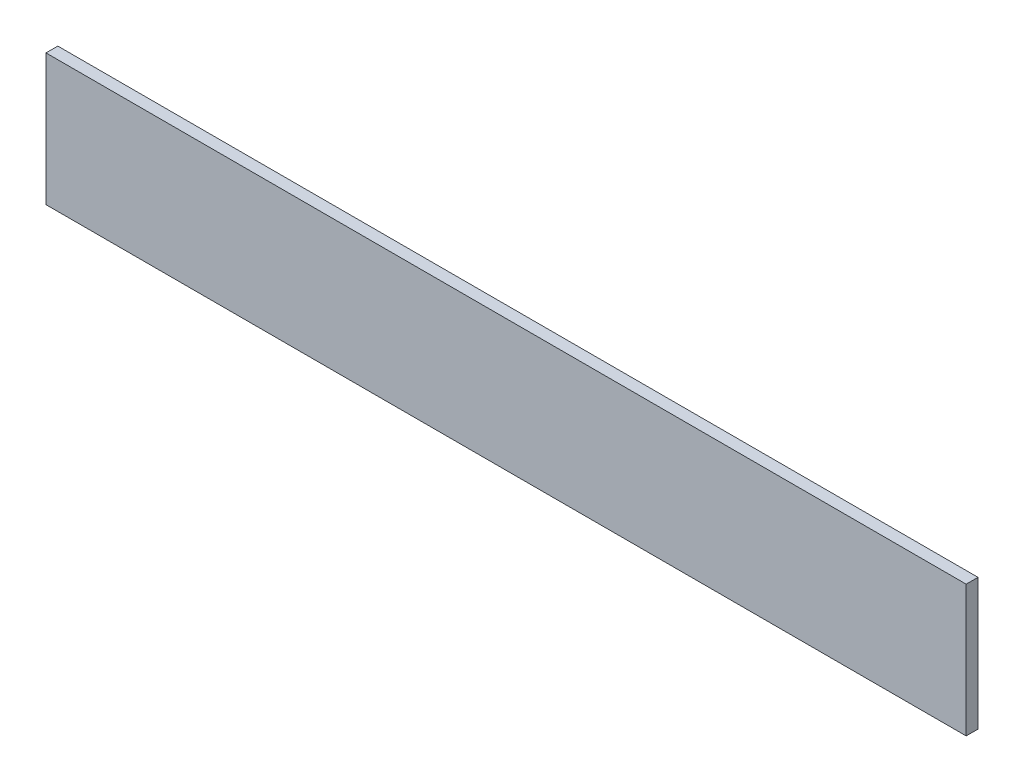
ISO-10303-21;
HEADER;
FILE_DESCRIPTION(('STEP AP214'),'2;1');
FILE_NAME('part.step','',(''),(''),'','','');
FILE_SCHEMA(('AUTOMOTIVE_DESIGN { 1 0 10303 214 1 1 1 1 }'));
ENDSEC;
DATA;
#1=APPLICATION_CONTEXT('core data for automotive mechanical design processes');
#2=APPLICATION_PROTOCOL_DEFINITION('international standard','automotive_design',2000,#1);
#3=PRODUCT_CONTEXT('',#1,'mechanical');
#4=PRODUCT('Part','Part','',(#3));
#5=PRODUCT_RELATED_PRODUCT_CATEGORY('part','',(#4));
#6=PRODUCT_DEFINITION_FORMATION('','',#4);
#7=PRODUCT_DEFINITION_CONTEXT('part definition',#1,'design');
#8=PRODUCT_DEFINITION('design','',#6,#7);
#9=PRODUCT_DEFINITION_SHAPE('','',#8);
#10=(LENGTH_UNIT() NAMED_UNIT(*) SI_UNIT(.MILLI.,.METRE.));
#11=(NAMED_UNIT(*) PLANE_ANGLE_UNIT() SI_UNIT($,.RADIAN.));
#12=(NAMED_UNIT(*) SI_UNIT($,.STERADIAN.) SOLID_ANGLE_UNIT());
#13=UNCERTAINTY_MEASURE_WITH_UNIT(LENGTH_MEASURE(1.E-05),#10,'distance_accuracy_value','');
#14=(GEOMETRIC_REPRESENTATION_CONTEXT(3) GLOBAL_UNCERTAINTY_ASSIGNED_CONTEXT((#13)) GLOBAL_UNIT_ASSIGNED_CONTEXT((#10,
#11,#12)) REPRESENTATION_CONTEXT('',''));
#15=CARTESIAN_POINT('',(0.,0.,0.));
#16=DIRECTION('',(0.,0.,1.));
#17=DIRECTION('',(1.,0.,0.));
#18=AXIS2_PLACEMENT_3D('',#15,#16,#17);
#19=CARTESIAN_POINT('',(35.,5.,0.));
#20=DIRECTION('',(0.,0.,1.));
#21=DIRECTION('',(1.,0.,0.));
#22=AXIS2_PLACEMENT_3D('',#19,#20,#21);
#23=PLANE('',#22);
#24=DIRECTION('',(0.,1.,0.));
#25=VECTOR('',#24,1.);
#26=CARTESIAN_POINT('',(70.,5.,0.));
#27=LINE('',#26,#25);
#28=CARTESIAN_POINT('',(70.,10.,0.));
#29=VERTEX_POINT('',#28);
#30=CARTESIAN_POINT('',(70.,0.,0.));
#31=VERTEX_POINT('',#30);
#32=EDGE_CURVE('E78',#29,#31,#27,.F.);
#33=ORIENTED_EDGE('',*,*,#32,.T.);
#34=DIRECTION('',(1.,0.,0.));
#35=VECTOR('',#34,1.);
#36=CARTESIAN_POINT('',(35.,0.,0.));
#37=LINE('',#36,#35);
#38=CARTESIAN_POINT('',(0.,0.,0.));
#39=VERTEX_POINT('',#38);
#40=EDGE_CURVE('E53',#31,#39,#37,.F.);
#41=ORIENTED_EDGE('',*,*,#40,.T.);
#42=DIRECTION('',(0.,1.,0.));
#43=VECTOR('',#42,1.);
#44=CARTESIAN_POINT('',(0.,5.,0.));
#45=LINE('',#44,#43);
#46=CARTESIAN_POINT('',(0.,10.,0.));
#47=VERTEX_POINT('',#46);
#48=EDGE_CURVE('E55',#39,#47,#45,.T.);
#49=ORIENTED_EDGE('',*,*,#48,.T.);
#50=DIRECTION('',(1.,0.,0.));
#51=VECTOR('',#50,1.);
#52=CARTESIAN_POINT('',(35.,10.,0.));
#53=LINE('',#52,#51);
#54=EDGE_CURVE('E18',#47,#29,#53,.T.);
#55=ORIENTED_EDGE('',*,*,#54,.T.);
#56=EDGE_LOOP('',(#33,#41,#49,#55));
#57=FACE_BOUND('',#56,.T.);
#58=ADVANCED_FACE('F15',(#57),#23,.F.);
#59=CARTESIAN_POINT('',(35.,10.,0.45));
#60=DIRECTION('',(0.,-1.,0.));
#61=DIRECTION('',(0.,0.,-1.));
#62=AXIS2_PLACEMENT_3D('',#59,#60,#61);
#63=PLANE('',#62);
#64=ORIENTED_EDGE('',*,*,#54,.F.);
#65=DIRECTION('',(0.,0.,-1.));
#66=VECTOR('',#65,1.);
#67=CARTESIAN_POINT('',(0.,10.,0.45));
#68=LINE('',#67,#66);
#69=CARTESIAN_POINT('',(0.,10.,0.9));
#70=VERTEX_POINT('',#69);
#71=EDGE_CURVE('E61',#47,#70,#68,.F.);
#72=ORIENTED_EDGE('',*,*,#71,.T.);
#73=DIRECTION('',(1.,0.,0.));
#74=VECTOR('',#73,1.);
#75=CARTESIAN_POINT('',(35.,10.,0.9));
#76=LINE('',#75,#74);
#77=CARTESIAN_POINT('',(70.,10.,0.9));
#78=VERTEX_POINT('',#77);
#79=EDGE_CURVE('E81',#78,#70,#76,.F.);
#80=ORIENTED_EDGE('',*,*,#79,.F.);
#81=DIRECTION('',(0.,0.,1.));
#82=VECTOR('',#81,1.);
#83=CARTESIAN_POINT('',(70.,10.,0.45));
#84=LINE('',#83,#82);
#85=EDGE_CURVE('E66',#78,#29,#84,.F.);
#86=ORIENTED_EDGE('',*,*,#85,.T.);
#87=EDGE_LOOP('',(#64,#72,#80,#86));
#88=FACE_BOUND('',#87,.T.);
#89=ADVANCED_FACE('F63',(#88),#63,.F.);
#90=CARTESIAN_POINT('',(0.,5.,0.45));
#91=DIRECTION('',(1.,0.,0.));
#92=DIRECTION('',(0.,0.,-1.));
#93=AXIS2_PLACEMENT_3D('',#90,#91,#92);
#94=PLANE('',#93);
#95=ORIENTED_EDGE('',*,*,#48,.F.);
#96=DIRECTION('',(0.,0.,1.));
#97=VECTOR('',#96,1.);
#98=CARTESIAN_POINT('',(0.,0.,0.45));
#99=LINE('',#98,#97);
#100=CARTESIAN_POINT('',(0.,0.,0.9));
#101=VERTEX_POINT('',#100);
#102=EDGE_CURVE('E73',#39,#101,#99,.T.);
#103=ORIENTED_EDGE('',*,*,#102,.T.);
#104=DIRECTION('',(0.,1.,0.));
#105=VECTOR('',#104,1.);
#106=CARTESIAN_POINT('',(0.,5.,0.9));
#107=LINE('',#106,#105);
#108=EDGE_CURVE('E70',#70,#101,#107,.F.);
#109=ORIENTED_EDGE('',*,*,#108,.F.);
#110=ORIENTED_EDGE('',*,*,#71,.F.);
#111=EDGE_LOOP('',(#95,#103,#109,#110));
#112=FACE_BOUND('',#111,.T.);
#113=ADVANCED_FACE('F68',(#112),#94,.F.);
#114=CARTESIAN_POINT('',(35.,0.,0.45));
#115=DIRECTION('',(0.,1.,0.));
#116=DIRECTION('',(0.,0.,1.));
#117=AXIS2_PLACEMENT_3D('',#114,#115,#116);
#118=PLANE('',#117);
#119=ORIENTED_EDGE('',*,*,#40,.F.);
#120=DIRECTION('',(0.,0.,1.));
#121=VECTOR('',#120,1.);
#122=CARTESIAN_POINT('',(70.,0.,0.45));
#123=LINE('',#122,#121);
#124=CARTESIAN_POINT('',(70.,0.,0.9));
#125=VERTEX_POINT('',#124);
#126=EDGE_CURVE('E33',#31,#125,#123,.T.);
#127=ORIENTED_EDGE('',*,*,#126,.T.);
#128=DIRECTION('',(1.,0.,0.));
#129=VECTOR('',#128,1.);
#130=CARTESIAN_POINT('',(35.,0.,0.9));
#131=LINE('',#130,#129);
#132=EDGE_CURVE('E24',#101,#125,#131,.T.);
#133=ORIENTED_EDGE('',*,*,#132,.F.);
#134=ORIENTED_EDGE('',*,*,#102,.F.);
#135=EDGE_LOOP('',(#119,#127,#133,#134));
#136=FACE_BOUND('',#135,.T.);
#137=ADVANCED_FACE('F87',(#136),#118,.F.);
#138=CARTESIAN_POINT('',(70.,5.,0.45));
#139=DIRECTION('',(-1.,0.,0.));
#140=DIRECTION('',(0.,0.,1.));
#141=AXIS2_PLACEMENT_3D('',#138,#139,#140);
#142=PLANE('',#141);
#143=ORIENTED_EDGE('',*,*,#32,.F.);
#144=ORIENTED_EDGE('',*,*,#85,.F.);
#145=DIRECTION('',(0.,1.,0.));
#146=VECTOR('',#145,1.);
#147=CARTESIAN_POINT('',(70.,5.,0.9));
#148=LINE('',#147,#146);
#149=EDGE_CURVE('E10',#125,#78,#148,.T.);
#150=ORIENTED_EDGE('',*,*,#149,.F.);
#151=ORIENTED_EDGE('',*,*,#126,.F.);
#152=EDGE_LOOP('',(#143,#144,#150,#151));
#153=FACE_BOUND('',#152,.T.);
#154=ADVANCED_FACE('F89',(#153),#142,.F.);
#155=CARTESIAN_POINT('',(35.,5.,0.9));
#156=DIRECTION('',(0.,0.,1.));
#157=DIRECTION('',(1.,0.,0.));
#158=AXIS2_PLACEMENT_3D('',#155,#156,#157);
#159=PLANE('',#158);
#160=ORIENTED_EDGE('',*,*,#132,.T.);
#161=ORIENTED_EDGE('',*,*,#149,.T.);
#162=ORIENTED_EDGE('',*,*,#79,.T.);
#163=ORIENTED_EDGE('',*,*,#108,.T.);
#164=EDGE_LOOP('',(#160,#161,#162,#163));
#165=FACE_BOUND('',#164,.T.);
#166=ADVANCED_FACE('F86',(#165),#159,.T.);
#167=CLOSED_SHELL('',(#58,#89,#113,#137,#154,#166));
#168=MANIFOLD_SOLID_BREP('B1',#167);
#169=ADVANCED_BREP_SHAPE_REPRESENTATION('',(#18,#168),#14);
#170=SHAPE_DEFINITION_REPRESENTATION(#9,#169);
ENDSEC;
END-ISO-10303-21;
